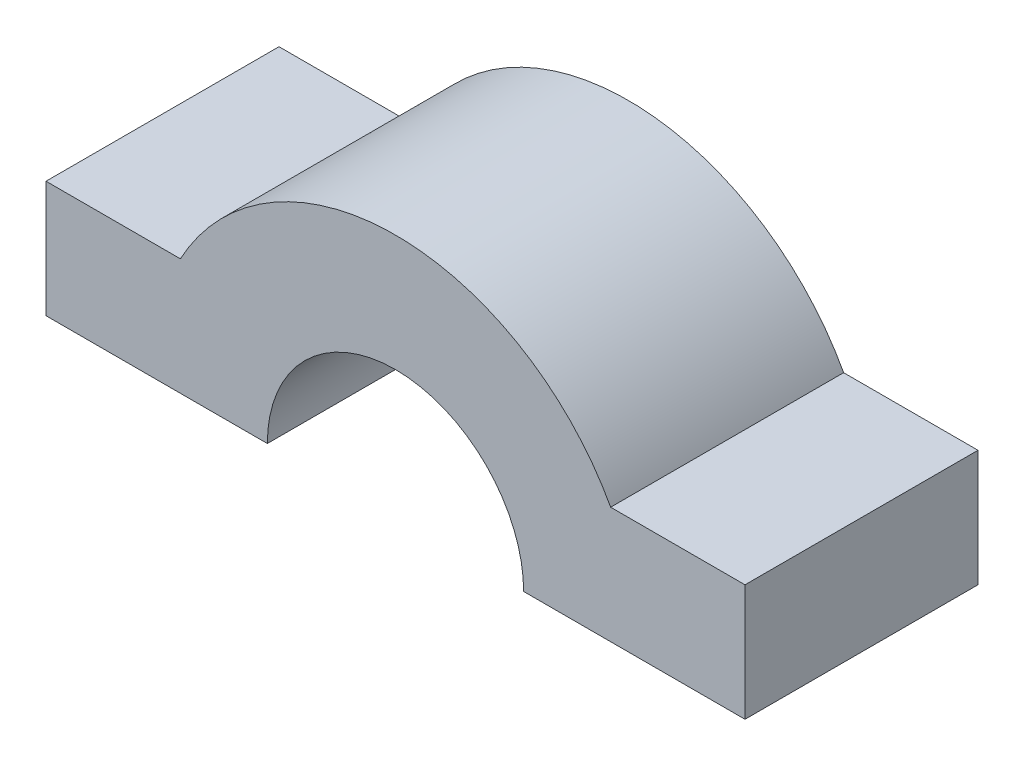
ISO-10303-21;
HEADER;
FILE_DESCRIPTION(('STEP AP214'),'2;1');
FILE_NAME('part.step','',(''),(''),'','','');
FILE_SCHEMA(('AUTOMOTIVE_DESIGN { 1 0 10303 214 1 1 1 1 }'));
ENDSEC;
DATA;
#1=APPLICATION_CONTEXT('core data for automotive mechanical design processes');
#2=APPLICATION_PROTOCOL_DEFINITION('international standard','automotive_design',2000,#1);
#3=PRODUCT_CONTEXT('',#1,'mechanical');
#4=PRODUCT('Part','Part','',(#3));
#5=PRODUCT_RELATED_PRODUCT_CATEGORY('part','',(#4));
#6=PRODUCT_DEFINITION_FORMATION('','',#4);
#7=PRODUCT_DEFINITION_CONTEXT('part definition',#1,'design');
#8=PRODUCT_DEFINITION('design','',#6,#7);
#9=PRODUCT_DEFINITION_SHAPE('','',#8);
#10=(LENGTH_UNIT() NAMED_UNIT(*) SI_UNIT(.MILLI.,.METRE.));
#11=(NAMED_UNIT(*) PLANE_ANGLE_UNIT() SI_UNIT($,.RADIAN.));
#12=(NAMED_UNIT(*) SI_UNIT($,.STERADIAN.) SOLID_ANGLE_UNIT());
#13=UNCERTAINTY_MEASURE_WITH_UNIT(LENGTH_MEASURE(1.E-05),#10,'distance_accuracy_value','');
#14=(GEOMETRIC_REPRESENTATION_CONTEXT(3) GLOBAL_UNCERTAINTY_ASSIGNED_CONTEXT((#13)) GLOBAL_UNIT_ASSIGNED_CONTEXT((#10,
#11,#12)) REPRESENTATION_CONTEXT('',''));
#15=CARTESIAN_POINT('',(0.,0.,0.));
#16=DIRECTION('',(0.,0.,1.));
#17=DIRECTION('',(1.,0.,0.));
#18=AXIS2_PLACEMENT_3D('',#15,#16,#17);
#19=CARTESIAN_POINT('',(-15.,0.,10.));
#20=DIRECTION('',(1.,0.,0.));
#21=DIRECTION('',(0.,0.,-1.));
#22=AXIS2_PLACEMENT_3D('',#19,#20,#21);
#23=PLANE('',#22);
#24=DIRECTION('',(0.,-1.,0.));
#25=VECTOR('',#24,1.);
#26=CARTESIAN_POINT('',(-15.,0.,0.));
#27=LINE('',#26,#25);
#28=CARTESIAN_POINT('',(-15.,5.,0.));
#29=VERTEX_POINT('',#28);
#30=CARTESIAN_POINT('',(-15.,0.,0.));
#31=VERTEX_POINT('',#30);
#32=EDGE_CURVE('E140',#29,#31,#27,.T.);
#33=ORIENTED_EDGE('',*,*,#32,.T.);
#34=DIRECTION('',(0.,0.,-1.));
#35=VECTOR('',#34,1.);
#36=CARTESIAN_POINT('',(-15.,0.,10.));
#37=LINE('',#36,#35);
#38=CARTESIAN_POINT('',(-15.,0.,10.));
#39=VERTEX_POINT('',#38);
#40=EDGE_CURVE('E11',#39,#31,#37,.T.);
#41=ORIENTED_EDGE('',*,*,#40,.F.);
#42=DIRECTION('',(0.,-1.,0.));
#43=VECTOR('',#42,1.);
#44=CARTESIAN_POINT('',(-15.,0.,10.));
#45=LINE('',#44,#43);
#46=CARTESIAN_POINT('',(-15.,5.,10.));
#47=VERTEX_POINT('',#46);
#48=EDGE_CURVE('E162',#47,#39,#45,.T.);
#49=ORIENTED_EDGE('',*,*,#48,.F.);
#50=DIRECTION('',(0.,0.,-1.));
#51=VECTOR('',#50,1.);
#52=CARTESIAN_POINT('',(-15.,5.,10.));
#53=LINE('',#52,#51);
#54=EDGE_CURVE('E136',#47,#29,#53,.T.);
#55=ORIENTED_EDGE('',*,*,#54,.T.);
#56=EDGE_LOOP('',(#33,#41,#49,#55));
#57=FACE_BOUND('',#56,.T.);
#58=ADVANCED_FACE('F39',(#57),#23,.F.);
#59=CARTESIAN_POINT('',(-15.,0.,10.));
#60=DIRECTION('',(0.,1.,0.));
#61=DIRECTION('',(0.,0.,1.));
#62=AXIS2_PLACEMENT_3D('',#59,#60,#61);
#63=PLANE('',#62);
#64=DIRECTION('',(1.,0.,0.));
#65=VECTOR('',#64,1.);
#66=CARTESIAN_POINT('',(-15.,0.,0.));
#67=LINE('',#66,#65);
#68=CARTESIAN_POINT('',(-5.5,0.,0.));
#69=VERTEX_POINT('',#68);
#70=EDGE_CURVE('E144',#31,#69,#67,.T.);
#71=ORIENTED_EDGE('',*,*,#70,.T.);
#72=DIRECTION('',(0.,0.,-1.));
#73=VECTOR('',#72,1.);
#74=CARTESIAN_POINT('',(-5.5,0.,10.));
#75=LINE('',#74,#73);
#76=CARTESIAN_POINT('',(-5.5,0.,10.));
#77=VERTEX_POINT('',#76);
#78=EDGE_CURVE('E48',#77,#69,#75,.T.);
#79=ORIENTED_EDGE('',*,*,#78,.F.);
#80=DIRECTION('',(1.,0.,0.));
#81=VECTOR('',#80,1.);
#82=CARTESIAN_POINT('',(-15.,0.,10.));
#83=LINE('',#82,#81);
#84=EDGE_CURVE('E99',#39,#77,#83,.T.);
#85=ORIENTED_EDGE('',*,*,#84,.F.);
#86=ORIENTED_EDGE('',*,*,#40,.T.);
#87=EDGE_LOOP('',(#71,#79,#85,#86));
#88=FACE_BOUND('',#87,.T.);
#89=ADVANCED_FACE('F208',(#88),#63,.F.);
#90=CARTESIAN_POINT('',(0.,0.,10.));
#91=DIRECTION('',(0.,0.,-1.));
#92=DIRECTION('',(-1.,0.,0.));
#93=AXIS2_PLACEMENT_3D('',#90,#91,#92);
#94=CYLINDRICAL_SURFACE('',#93,5.5);
#95=CARTESIAN_POINT('',(0.,0.,0.));
#96=DIRECTION('',(0.,0.,-1.));
#97=DIRECTION('',(1.,0.,0.));
#98=AXIS2_PLACEMENT_3D('',#95,#96,#97);
#99=CIRCLE('',#98,5.5);
#100=CARTESIAN_POINT('',(5.5,0.,0.));
#101=VERTEX_POINT('',#100);
#102=EDGE_CURVE('E147',#69,#101,#99,.T.);
#103=ORIENTED_EDGE('',*,*,#102,.T.);
#104=DIRECTION('',(0.,0.,-1.));
#105=VECTOR('',#104,1.);
#106=CARTESIAN_POINT('',(5.5,0.,10.));
#107=LINE('',#106,#105);
#108=CARTESIAN_POINT('',(5.5,0.,10.));
#109=VERTEX_POINT('',#108);
#110=EDGE_CURVE('E173',#109,#101,#107,.T.);
#111=ORIENTED_EDGE('',*,*,#110,.F.);
#112=CARTESIAN_POINT('',(0.,0.,10.));
#113=DIRECTION('',(0.,0.,-1.));
#114=DIRECTION('',(1.,0.,0.));
#115=AXIS2_PLACEMENT_3D('',#112,#113,#114);
#116=CIRCLE('',#115,5.5);
#117=EDGE_CURVE('E183',#77,#109,#116,.T.);
#118=ORIENTED_EDGE('',*,*,#117,.F.);
#119=ORIENTED_EDGE('',*,*,#78,.T.);
#120=EDGE_LOOP('',(#103,#111,#118,#119));
#121=FACE_BOUND('',#120,.T.);
#122=ADVANCED_FACE('F181',(#121),#94,.F.);
#123=CARTESIAN_POINT('',(5.5,0.,10.));
#124=DIRECTION('',(0.,1.,0.));
#125=DIRECTION('',(-1.,0.,0.));
#126=AXIS2_PLACEMENT_3D('',#123,#124,#125);
#127=PLANE('',#126);
#128=DIRECTION('',(1.,0.,0.));
#129=VECTOR('',#128,1.);
#130=CARTESIAN_POINT('',(5.5,0.,0.));
#131=LINE('',#130,#129);
#132=CARTESIAN_POINT('',(15.,0.,0.));
#133=VERTEX_POINT('',#132);
#134=EDGE_CURVE('E150',#101,#133,#131,.T.);
#135=ORIENTED_EDGE('',*,*,#134,.T.);
#136=DIRECTION('',(0.,0.,-1.));
#137=VECTOR('',#136,1.);
#138=CARTESIAN_POINT('',(15.,0.,10.));
#139=LINE('',#138,#137);
#140=CARTESIAN_POINT('',(15.,0.,10.));
#141=VERTEX_POINT('',#140);
#142=EDGE_CURVE('E169',#141,#133,#139,.T.);
#143=ORIENTED_EDGE('',*,*,#142,.F.);
#144=DIRECTION('',(1.,0.,0.));
#145=VECTOR('',#144,1.);
#146=CARTESIAN_POINT('',(5.5,0.,10.));
#147=LINE('',#146,#145);
#148=EDGE_CURVE('E196',#109,#141,#147,.T.);
#149=ORIENTED_EDGE('',*,*,#148,.F.);
#150=ORIENTED_EDGE('',*,*,#110,.T.);
#151=EDGE_LOOP('',(#135,#143,#149,#150));
#152=FACE_BOUND('',#151,.T.);
#153=ADVANCED_FACE('F191',(#152),#127,.F.);
#154=CARTESIAN_POINT('',(15.,0.,10.));
#155=DIRECTION('',(-1.,0.,0.));
#156=DIRECTION('',(0.,0.,1.));
#157=AXIS2_PLACEMENT_3D('',#154,#155,#156);
#158=PLANE('',#157);
#159=DIRECTION('',(0.,1.,0.));
#160=VECTOR('',#159,1.);
#161=CARTESIAN_POINT('',(15.,0.,0.));
#162=LINE('',#161,#160);
#163=CARTESIAN_POINT('',(15.,5.,0.));
#164=VERTEX_POINT('',#163);
#165=EDGE_CURVE('E153',#133,#164,#162,.T.);
#166=ORIENTED_EDGE('',*,*,#165,.T.);
#167=DIRECTION('',(0.,0.,-1.));
#168=VECTOR('',#167,1.);
#169=CARTESIAN_POINT('',(15.,5.,10.));
#170=LINE('',#169,#168);
#171=CARTESIAN_POINT('',(15.,5.,10.));
#172=VERTEX_POINT('',#171);
#173=EDGE_CURVE('E129',#172,#164,#170,.T.);
#174=ORIENTED_EDGE('',*,*,#173,.F.);
#175=DIRECTION('',(0.,1.,0.));
#176=VECTOR('',#175,1.);
#177=CARTESIAN_POINT('',(15.,0.,10.));
#178=LINE('',#177,#176);
#179=EDGE_CURVE('E118',#141,#172,#178,.T.);
#180=ORIENTED_EDGE('',*,*,#179,.F.);
#181=ORIENTED_EDGE('',*,*,#142,.T.);
#182=EDGE_LOOP('',(#166,#174,#180,#181));
#183=FACE_BOUND('',#182,.T.);
#184=ADVANCED_FACE('F194',(#183),#158,.F.);
#185=CARTESIAN_POINT('',(9.23309265630969,5.,10.));
#186=DIRECTION('',(0.,-1.,0.));
#187=DIRECTION('',(1.,0.,0.));
#188=AXIS2_PLACEMENT_3D('',#185,#186,#187);
#189=PLANE('',#188);
#190=DIRECTION('',(-1.,0.,0.));
#191=VECTOR('',#190,1.);
#192=CARTESIAN_POINT('',(9.23309265630969,5.,0.));
#193=LINE('',#192,#191);
#194=CARTESIAN_POINT('',(9.23309265630969,5.,0.));
#195=VERTEX_POINT('',#194);
#196=EDGE_CURVE('E127',#164,#195,#193,.T.);
#197=ORIENTED_EDGE('',*,*,#196,.T.);
#198=DIRECTION('',(0.,0.,-1.));
#199=VECTOR('',#198,1.);
#200=CARTESIAN_POINT('',(9.23309265630969,5.,10.));
#201=LINE('',#200,#199);
#202=CARTESIAN_POINT('',(9.23309265630969,5.,10.));
#203=VERTEX_POINT('',#202);
#204=EDGE_CURVE('E124',#203,#195,#201,.T.);
#205=ORIENTED_EDGE('',*,*,#204,.F.);
#206=DIRECTION('',(-1.,0.,0.));
#207=VECTOR('',#206,1.);
#208=CARTESIAN_POINT('',(9.23309265630969,5.,10.));
#209=LINE('',#208,#207);
#210=EDGE_CURVE('E112',#172,#203,#209,.T.);
#211=ORIENTED_EDGE('',*,*,#210,.F.);
#212=ORIENTED_EDGE('',*,*,#173,.T.);
#213=EDGE_LOOP('',(#197,#205,#211,#212));
#214=FACE_BOUND('',#213,.T.);
#215=ADVANCED_FACE('F125',(#214),#189,.F.);
#216=CARTESIAN_POINT('',(0.,0.,10.));
#217=DIRECTION('',(0.,0.,-1.));
#218=DIRECTION('',(-1.,0.,0.));
#219=AXIS2_PLACEMENT_3D('',#216,#217,#218);
#220=CYLINDRICAL_SURFACE('',#219,10.5);
#221=CARTESIAN_POINT('',(0.,0.,0.));
#222=DIRECTION('',(0.,0.,1.));
#223=DIRECTION('',(1.,0.,0.));
#224=AXIS2_PLACEMENT_3D('',#221,#222,#223);
#225=CIRCLE('',#224,10.5);
#226=CARTESIAN_POINT('',(-9.23309265630969,5.,0.));
#227=VERTEX_POINT('',#226);
#228=EDGE_CURVE('E85',#195,#227,#225,.T.);
#229=ORIENTED_EDGE('',*,*,#228,.T.);
#230=DIRECTION('',(0.,0.,-1.));
#231=VECTOR('',#230,1.);
#232=CARTESIAN_POINT('',(-9.23309265630969,5.,10.));
#233=LINE('',#232,#231);
#234=CARTESIAN_POINT('',(-9.23309265630969,5.,10.));
#235=VERTEX_POINT('',#234);
#236=EDGE_CURVE('E130',#235,#227,#233,.T.);
#237=ORIENTED_EDGE('',*,*,#236,.F.);
#238=CARTESIAN_POINT('',(0.,0.,10.));
#239=DIRECTION('',(0.,0.,1.));
#240=DIRECTION('',(1.,0.,0.));
#241=AXIS2_PLACEMENT_3D('',#238,#239,#240);
#242=CIRCLE('',#241,10.5);
#243=EDGE_CURVE('E116',#203,#235,#242,.T.);
#244=ORIENTED_EDGE('',*,*,#243,.F.);
#245=ORIENTED_EDGE('',*,*,#204,.T.);
#246=EDGE_LOOP('',(#229,#237,#244,#245));
#247=FACE_BOUND('',#246,.T.);
#248=ADVANCED_FACE('F132',(#247),#220,.T.);
#249=CARTESIAN_POINT('',(-15.,5.,10.));
#250=DIRECTION('',(0.,-1.,0.));
#251=DIRECTION('',(0.,0.,-1.));
#252=AXIS2_PLACEMENT_3D('',#249,#250,#251);
#253=PLANE('',#252);
#254=DIRECTION('',(-1.,0.,0.));
#255=VECTOR('',#254,1.);
#256=CARTESIAN_POINT('',(-15.,5.,0.));
#257=LINE('',#256,#255);
#258=EDGE_CURVE('E91',#227,#29,#257,.T.);
#259=ORIENTED_EDGE('',*,*,#258,.T.);
#260=ORIENTED_EDGE('',*,*,#54,.F.);
#261=DIRECTION('',(-1.,0.,0.));
#262=VECTOR('',#261,1.);
#263=CARTESIAN_POINT('',(-15.,5.,10.));
#264=LINE('',#263,#262);
#265=EDGE_CURVE('E56',#235,#47,#264,.T.);
#266=ORIENTED_EDGE('',*,*,#265,.F.);
#267=ORIENTED_EDGE('',*,*,#236,.T.);
#268=EDGE_LOOP('',(#259,#260,#266,#267));
#269=FACE_BOUND('',#268,.T.);
#270=ADVANCED_FACE('F224',(#269),#253,.F.);
#271=CARTESIAN_POINT('',(0.,0.,10.));
#272=DIRECTION('',(0.,0.,1.));
#273=DIRECTION('',(1.,0.,0.));
#274=AXIS2_PLACEMENT_3D('',#271,#272,#273);
#275=PLANE('',#274);
#276=ORIENTED_EDGE('',*,*,#48,.T.);
#277=ORIENTED_EDGE('',*,*,#84,.T.);
#278=ORIENTED_EDGE('',*,*,#117,.T.);
#279=ORIENTED_EDGE('',*,*,#148,.T.);
#280=ORIENTED_EDGE('',*,*,#179,.T.);
#281=ORIENTED_EDGE('',*,*,#210,.T.);
#282=ORIENTED_EDGE('',*,*,#243,.T.);
#283=ORIENTED_EDGE('',*,*,#265,.T.);
#284=EDGE_LOOP('',(#276,#277,#278,#279,#280,#281,#282,#283));
#285=FACE_BOUND('',#284,.T.);
#286=ADVANCED_FACE('F114',(#285),#275,.T.);
#287=CARTESIAN_POINT('',(0.,0.,0.));
#288=DIRECTION('',(0.,0.,1.));
#289=DIRECTION('',(1.,0.,0.));
#290=AXIS2_PLACEMENT_3D('',#287,#288,#289);
#291=PLANE('',#290);
#292=ORIENTED_EDGE('',*,*,#32,.F.);
#293=ORIENTED_EDGE('',*,*,#258,.F.);
#294=ORIENTED_EDGE('',*,*,#228,.F.);
#295=ORIENTED_EDGE('',*,*,#196,.F.);
#296=ORIENTED_EDGE('',*,*,#165,.F.);
#297=ORIENTED_EDGE('',*,*,#134,.F.);
#298=ORIENTED_EDGE('',*,*,#102,.F.);
#299=ORIENTED_EDGE('',*,*,#70,.F.);
#300=EDGE_LOOP('',(#292,#293,#294,#295,#296,#297,#298,#299));
#301=FACE_BOUND('',#300,.T.);
#302=ADVANCED_FACE('F187',(#301),#291,.F.);
#303=CLOSED_SHELL('',(#58,#89,#122,#153,#184,#215,#248,#270,#286,#302));
#304=MANIFOLD_SOLID_BREP('B2',#303);
#305=ADVANCED_BREP_SHAPE_REPRESENTATION('',(#18,#304),#14);
#306=SHAPE_DEFINITION_REPRESENTATION(#9,#305);
ENDSEC;
END-ISO-10303-21;
